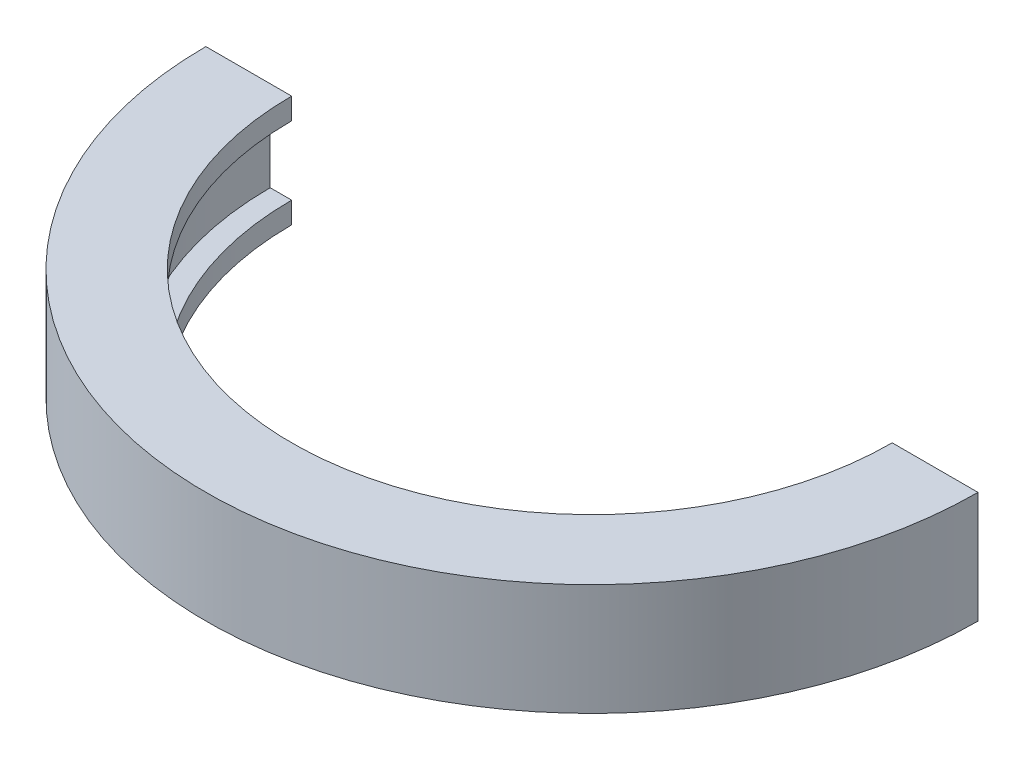
ISO-10303-21;
HEADER;
FILE_DESCRIPTION(('STEP AP214'),'2;1');
FILE_NAME('part.step','',(''),(''),'','','');
FILE_SCHEMA(('AUTOMOTIVE_DESIGN { 1 0 10303 214 1 1 1 1 }'));
ENDSEC;
DATA;
#1=APPLICATION_CONTEXT('core data for automotive mechanical design processes');
#2=APPLICATION_PROTOCOL_DEFINITION('international standard','automotive_design',2000,#1);
#3=PRODUCT_CONTEXT('',#1,'mechanical');
#4=PRODUCT('Part','Part','',(#3));
#5=PRODUCT_RELATED_PRODUCT_CATEGORY('part','',(#4));
#6=PRODUCT_DEFINITION_FORMATION('','',#4);
#7=PRODUCT_DEFINITION_CONTEXT('part definition',#1,'design');
#8=PRODUCT_DEFINITION('design','',#6,#7);
#9=PRODUCT_DEFINITION_SHAPE('','',#8);
#10=(LENGTH_UNIT() NAMED_UNIT(*) SI_UNIT(.MILLI.,.METRE.));
#11=(NAMED_UNIT(*) PLANE_ANGLE_UNIT() SI_UNIT($,.RADIAN.));
#12=(NAMED_UNIT(*) SI_UNIT($,.STERADIAN.) SOLID_ANGLE_UNIT());
#13=UNCERTAINTY_MEASURE_WITH_UNIT(LENGTH_MEASURE(1.E-05),#10,'distance_accuracy_value','');
#14=(GEOMETRIC_REPRESENTATION_CONTEXT(3) GLOBAL_UNCERTAINTY_ASSIGNED_CONTEXT((#13)) GLOBAL_UNIT_ASSIGNED_CONTEXT((#10,
#11,#12)) REPRESENTATION_CONTEXT('',''));
#15=CARTESIAN_POINT('',(0.,0.,0.));
#16=DIRECTION('',(0.,0.,1.));
#17=DIRECTION('',(1.,0.,0.));
#18=AXIS2_PLACEMENT_3D('',#15,#16,#17);
#19=CARTESIAN_POINT('',(0.,13.,3.15599662619719));
#20=DIRECTION('',(0.,0.,-1.));
#21=DIRECTION('',(-1.,0.,0.));
#22=AXIS2_PLACEMENT_3D('',#19,#20,#21);
#23=PLANE('',#22);
#24=DIRECTION('',(0.,-1.,0.));
#25=VECTOR('',#24,1.);
#26=CARTESIAN_POINT('',(-59.1914357275866,13.,3.15599662619719));
#27=LINE('',#26,#25);
#28=CARTESIAN_POINT('',(-59.1914357275866,13.,3.15599662619719));
#29=VERTEX_POINT('',#28);
#30=CARTESIAN_POINT('',(-59.1914357275866,8.,3.15599662619719));
#31=VERTEX_POINT('',#30);
#32=EDGE_CURVE('E70',#29,#31,#27,.T.);
#33=ORIENTED_EDGE('',*,*,#32,.T.);
#34=DIRECTION('',(-1.,0.,0.));
#35=VECTOR('',#34,1.);
#36=CARTESIAN_POINT('',(0.,8.,3.15599662619719));
#37=LINE('',#36,#35);
#38=CARTESIAN_POINT('',(-64.1914357275866,8.,3.15599662619719));
#39=VERTEX_POINT('',#38);
#40=EDGE_CURVE('E147',#31,#39,#37,.T.);
#41=ORIENTED_EDGE('',*,*,#40,.T.);
#42=DIRECTION('',(0.,1.,0.));
#43=VECTOR('',#42,1.);
#44=CARTESIAN_POINT('',(-64.1914357275866,13.,3.15599662619719));
#45=LINE('',#44,#43);
#46=CARTESIAN_POINT('',(-64.1914357275866,-8.,3.15599662619719));
#47=VERTEX_POINT('',#46);
#48=EDGE_CURVE('E151',#39,#47,#45,.F.);
#49=ORIENTED_EDGE('',*,*,#48,.T.);
#50=DIRECTION('',(1.,0.,0.));
#51=VECTOR('',#50,1.);
#52=CARTESIAN_POINT('',(0.,-8.,3.15599662619719));
#53=LINE('',#52,#51);
#54=CARTESIAN_POINT('',(-59.1914357275866,-8.,3.15599662619719));
#55=VERTEX_POINT('',#54);
#56=EDGE_CURVE('E130',#47,#55,#53,.T.);
#57=ORIENTED_EDGE('',*,*,#56,.T.);
#58=CARTESIAN_POINT('',(-59.1914357275866,-13.,3.15599662619719));
#59=VERTEX_POINT('',#58);
#60=EDGE_CURVE('E93',#55,#59,#27,.T.);
#61=ORIENTED_EDGE('',*,*,#60,.T.);
#62=DIRECTION('',(1.,0.,0.));
#63=VECTOR('',#62,1.);
#64=CARTESIAN_POINT('',(0.,-13.,3.15599662619719));
#65=LINE('',#64,#63);
#66=CARTESIAN_POINT('',(-79.1914357275866,-13.,3.15599662619719));
#67=VERTEX_POINT('',#66);
#68=EDGE_CURVE('E154',#67,#59,#65,.T.);
#69=ORIENTED_EDGE('',*,*,#68,.F.);
#70=DIRECTION('',(0.,-1.,0.));
#71=VECTOR('',#70,1.);
#72=CARTESIAN_POINT('',(-79.1914357275866,13.,3.15599662619719));
#73=LINE('',#72,#71);
#74=CARTESIAN_POINT('',(-79.1914357275866,13.,3.15599662619719));
#75=VERTEX_POINT('',#74);
#76=EDGE_CURVE('E97',#75,#67,#73,.T.);
#77=ORIENTED_EDGE('',*,*,#76,.F.);
#78=DIRECTION('',(1.,0.,0.));
#79=VECTOR('',#78,1.);
#80=CARTESIAN_POINT('',(0.,13.,3.15599662619719));
#81=LINE('',#80,#79);
#82=EDGE_CURVE('E155',#75,#29,#81,.T.);
#83=ORIENTED_EDGE('',*,*,#82,.T.);
#84=EDGE_LOOP('',(#33,#41,#49,#57,#61,#69,#77,#83));
#85=FACE_BOUND('',#84,.T.);
#86=ADVANCED_FACE('F45',(#85),#23,.T.);
#87=DIRECTION('',(0.,1.,0.));
#88=VECTOR('',#87,1.);
#89=CARTESIAN_POINT('',(85.8085642724134,13.,3.15599662619719));
#90=LINE('',#89,#88);
#91=CARTESIAN_POINT('',(85.8085642724134,-8.,3.15599662619719));
#92=VERTEX_POINT('',#91);
#93=CARTESIAN_POINT('',(85.8085642724134,8.,3.15599662619719));
#94=VERTEX_POINT('',#93);
#95=EDGE_CURVE('E11',#92,#94,#90,.T.);
#96=ORIENTED_EDGE('',*,*,#95,.T.);
#97=DIRECTION('',(-1.,0.,0.));
#98=VECTOR('',#97,1.);
#99=CARTESIAN_POINT('',(0.,8.,3.15599662619719));
#100=LINE('',#99,#98);
#101=CARTESIAN_POINT('',(80.8085642724134,8.,3.15599662619719));
#102=VERTEX_POINT('',#101);
#103=EDGE_CURVE('E141',#94,#102,#100,.T.);
#104=ORIENTED_EDGE('',*,*,#103,.T.);
#105=DIRECTION('',(0.,-1.,0.));
#106=VECTOR('',#105,1.);
#107=CARTESIAN_POINT('',(80.8085642724134,13.,3.15599662619719));
#108=LINE('',#107,#106);
#109=CARTESIAN_POINT('',(80.8085642724134,13.,3.15599662619719));
#110=VERTEX_POINT('',#109);
#111=EDGE_CURVE('E178',#110,#102,#108,.T.);
#112=ORIENTED_EDGE('',*,*,#111,.F.);
#113=CARTESIAN_POINT('',(100.808564272413,13.,3.15599662619719));
#114=VERTEX_POINT('',#113);
#115=EDGE_CURVE('E160',#110,#114,#81,.T.);
#116=ORIENTED_EDGE('',*,*,#115,.T.);
#117=DIRECTION('',(0.,-1.,0.));
#118=VECTOR('',#117,1.);
#119=CARTESIAN_POINT('',(100.808564272413,13.,3.15599662619719));
#120=LINE('',#119,#118);
#121=CARTESIAN_POINT('',(100.808564272413,-13.,3.15599662619719));
#122=VERTEX_POINT('',#121);
#123=EDGE_CURVE('E182',#114,#122,#120,.T.);
#124=ORIENTED_EDGE('',*,*,#123,.T.);
#125=CARTESIAN_POINT('',(80.8085642724134,-13.,3.15599662619719));
#126=VERTEX_POINT('',#125);
#127=EDGE_CURVE('E169',#126,#122,#65,.T.);
#128=ORIENTED_EDGE('',*,*,#127,.F.);
#129=CARTESIAN_POINT('',(80.8085642724134,-7.99999999999999,3.15599662619719));
#130=VERTEX_POINT('',#129);
#131=EDGE_CURVE('E136',#130,#126,#108,.T.);
#132=ORIENTED_EDGE('',*,*,#131,.F.);
#133=DIRECTION('',(1.,0.,0.));
#134=VECTOR('',#133,1.);
#135=CARTESIAN_POINT('',(0.,-8.,3.15599662619719));
#136=LINE('',#135,#134);
#137=EDGE_CURVE('E61',#130,#92,#136,.T.);
#138=ORIENTED_EDGE('',*,*,#137,.T.);
#139=EDGE_LOOP('',(#96,#104,#112,#116,#124,#128,#132,#138));
#140=FACE_BOUND('',#139,.T.);
#141=ADVANCED_FACE('F134',(#140),#23,.T.);
#142=CARTESIAN_POINT('',(10.8085642724134,13.,3.15599662619719));
#143=DIRECTION('',(0.,-1.,0.));
#144=DIRECTION('',(0.,0.,-1.));
#145=AXIS2_PLACEMENT_3D('',#142,#143,#144);
#146=CYLINDRICAL_SURFACE('',#145,70.);
#147=ORIENTED_EDGE('',*,*,#111,.T.);
#148=CARTESIAN_POINT('',(10.8085642724134,8.,3.15599662619719));
#149=DIRECTION('',(0.,-1.,0.));
#150=DIRECTION('',(0.,0.,-1.));
#151=AXIS2_PLACEMENT_3D('',#148,#149,#150);
#152=CIRCLE('',#151,70.);
#153=EDGE_CURVE('E54',#102,#31,#152,.T.);
#154=ORIENTED_EDGE('',*,*,#153,.T.);
#155=ORIENTED_EDGE('',*,*,#32,.F.);
#156=CARTESIAN_POINT('',(10.8085642724134,13.,3.15599662619719));
#157=DIRECTION('',(0.,1.,0.));
#158=DIRECTION('',(0.,0.,1.));
#159=AXIS2_PLACEMENT_3D('',#156,#157,#158);
#160=CIRCLE('',#159,70.);
#161=EDGE_CURVE('E163',#29,#110,#160,.T.);
#162=ORIENTED_EDGE('',*,*,#161,.T.);
#163=EDGE_LOOP('',(#147,#154,#155,#162));
#164=FACE_BOUND('',#163,.T.);
#165=ADVANCED_FACE('F190',(#164),#146,.F.);
#166=ORIENTED_EDGE('',*,*,#60,.F.);
#167=CARTESIAN_POINT('',(10.8085642724134,-8.,3.15599662619719));
#168=DIRECTION('',(0.,1.,0.));
#169=DIRECTION('',(0.,0.,1.));
#170=AXIS2_PLACEMENT_3D('',#167,#168,#169);
#171=CIRCLE('',#170,70.);
#172=EDGE_CURVE('E187',#55,#130,#171,.T.);
#173=ORIENTED_EDGE('',*,*,#172,.T.);
#174=ORIENTED_EDGE('',*,*,#131,.T.);
#175=CARTESIAN_POINT('',(10.8085642724134,-13.,3.15599662619719));
#176=DIRECTION('',(0.,1.,0.));
#177=DIRECTION('',(0.,0.,1.));
#178=AXIS2_PLACEMENT_3D('',#175,#176,#177);
#179=CIRCLE('',#178,70.);
#180=EDGE_CURVE('E159',#59,#126,#179,.T.);
#181=ORIENTED_EDGE('',*,*,#180,.F.);
#182=EDGE_LOOP('',(#166,#173,#174,#181));
#183=FACE_BOUND('',#182,.T.);
#184=ADVANCED_FACE('F209',(#183),#146,.F.);
#185=CARTESIAN_POINT('',(10.8085642724134,13.,3.15599662619719));
#186=DIRECTION('',(0.,-1.,0.));
#187=DIRECTION('',(0.,0.,-1.));
#188=AXIS2_PLACEMENT_3D('',#185,#186,#187);
#189=CYLINDRICAL_SURFACE('',#188,90.);
#190=CARTESIAN_POINT('',(10.8085642724134,-13.,3.15599662619719));
#191=DIRECTION('',(0.,1.,0.));
#192=DIRECTION('',(0.,0.,1.));
#193=AXIS2_PLACEMENT_3D('',#190,#191,#192);
#194=CIRCLE('',#193,90.);
#195=EDGE_CURVE('E168',#67,#122,#194,.T.);
#196=ORIENTED_EDGE('',*,*,#195,.T.);
#197=ORIENTED_EDGE('',*,*,#123,.F.);
#198=CARTESIAN_POINT('',(10.8085642724134,13.,3.15599662619719));
#199=DIRECTION('',(0.,1.,0.));
#200=DIRECTION('',(0.,0.,1.));
#201=AXIS2_PLACEMENT_3D('',#198,#199,#200);
#202=CIRCLE('',#201,90.);
#203=EDGE_CURVE('E158',#75,#114,#202,.T.);
#204=ORIENTED_EDGE('',*,*,#203,.F.);
#205=ORIENTED_EDGE('',*,*,#76,.T.);
#206=EDGE_LOOP('',(#196,#197,#204,#205));
#207=FACE_BOUND('',#206,.T.);
#208=ADVANCED_FACE('F47',(#207),#189,.T.);
#209=CARTESIAN_POINT('',(0.,13.,0.));
#210=DIRECTION('',(0.,1.,0.));
#211=DIRECTION('',(0.,0.,1.));
#212=AXIS2_PLACEMENT_3D('',#209,#210,#211);
#213=PLANE('',#212);
#214=ORIENTED_EDGE('',*,*,#82,.F.);
#215=ORIENTED_EDGE('',*,*,#203,.T.);
#216=ORIENTED_EDGE('',*,*,#115,.F.);
#217=ORIENTED_EDGE('',*,*,#161,.F.);
#218=EDGE_LOOP('',(#214,#215,#216,#217));
#219=FACE_BOUND('',#218,.T.);
#220=ADVANCED_FACE('F196',(#219),#213,.T.);
#221=CARTESIAN_POINT('',(0.,-13.,0.));
#222=DIRECTION('',(0.,1.,0.));
#223=DIRECTION('',(0.,0.,1.));
#224=AXIS2_PLACEMENT_3D('',#221,#222,#223);
#225=PLANE('',#224);
#226=ORIENTED_EDGE('',*,*,#68,.T.);
#227=ORIENTED_EDGE('',*,*,#180,.T.);
#228=ORIENTED_EDGE('',*,*,#127,.T.);
#229=ORIENTED_EDGE('',*,*,#195,.F.);
#230=EDGE_LOOP('',(#226,#227,#228,#229));
#231=FACE_BOUND('',#230,.T.);
#232=ADVANCED_FACE('F205',(#231),#225,.F.);
#233=CARTESIAN_POINT('',(-59.1914357275866,8.,3.15599662619719));
#234=DIRECTION('',(0.,-1.,0.));
#235=DIRECTION('',(0.,0.,-1.));
#236=AXIS2_PLACEMENT_3D('',#233,#234,#235);
#237=PLANE('',#236);
#238=ORIENTED_EDGE('',*,*,#153,.F.);
#239=ORIENTED_EDGE('',*,*,#103,.F.);
#240=CARTESIAN_POINT('',(10.8085642724134,8.,3.15599662619719));
#241=DIRECTION('',(0.,1.,0.));
#242=DIRECTION('',(0.,0.,1.));
#243=AXIS2_PLACEMENT_3D('',#240,#241,#242);
#244=CIRCLE('',#243,75.);
#245=EDGE_CURVE('E126',#39,#94,#244,.T.);
#246=ORIENTED_EDGE('',*,*,#245,.F.);
#247=ORIENTED_EDGE('',*,*,#40,.F.);
#248=EDGE_LOOP('',(#238,#239,#246,#247));
#249=FACE_BOUND('',#248,.T.);
#250=ADVANCED_FACE('F224',(#249),#237,.T.);
#251=CARTESIAN_POINT('',(10.8085642724134,13.,3.15599662619719));
#252=DIRECTION('',(0.,1.,0.));
#253=DIRECTION('',(0.,0.,1.));
#254=AXIS2_PLACEMENT_3D('',#251,#252,#253);
#255=CYLINDRICAL_SURFACE('',#254,75.);
#256=ORIENTED_EDGE('',*,*,#245,.T.);
#257=ORIENTED_EDGE('',*,*,#95,.F.);
#258=CARTESIAN_POINT('',(10.8085642724134,-8.,3.15599662619719));
#259=DIRECTION('',(0.,1.,0.));
#260=DIRECTION('',(0.,0.,1.));
#261=AXIS2_PLACEMENT_3D('',#258,#259,#260);
#262=CIRCLE('',#261,75.);
#263=EDGE_CURVE('E123',#47,#92,#262,.T.);
#264=ORIENTED_EDGE('',*,*,#263,.F.);
#265=ORIENTED_EDGE('',*,*,#48,.F.);
#266=EDGE_LOOP('',(#256,#257,#264,#265));
#267=FACE_BOUND('',#266,.T.);
#268=ADVANCED_FACE('F122',(#267),#255,.F.);
#269=CARTESIAN_POINT('',(-59.1914357275866,-8.,3.15599662619719));
#270=DIRECTION('',(0.,1.,0.));
#271=DIRECTION('',(0.,0.,1.));
#272=AXIS2_PLACEMENT_3D('',#269,#270,#271);
#273=PLANE('',#272);
#274=ORIENTED_EDGE('',*,*,#263,.T.);
#275=ORIENTED_EDGE('',*,*,#137,.F.);
#276=ORIENTED_EDGE('',*,*,#172,.F.);
#277=ORIENTED_EDGE('',*,*,#56,.F.);
#278=EDGE_LOOP('',(#274,#275,#276,#277));
#279=FACE_BOUND('',#278,.T.);
#280=ADVANCED_FACE('F129',(#279),#273,.T.);
#281=CLOSED_SHELL('',(#86,#141,#165,#184,#208,#220,#232,#250,#268,#280));
#282=MANIFOLD_SOLID_BREP('B2',#281);
#283=ADVANCED_BREP_SHAPE_REPRESENTATION('',(#18,#282),#14);
#284=SHAPE_DEFINITION_REPRESENTATION(#9,#283);
ENDSEC;
END-ISO-10303-21;
